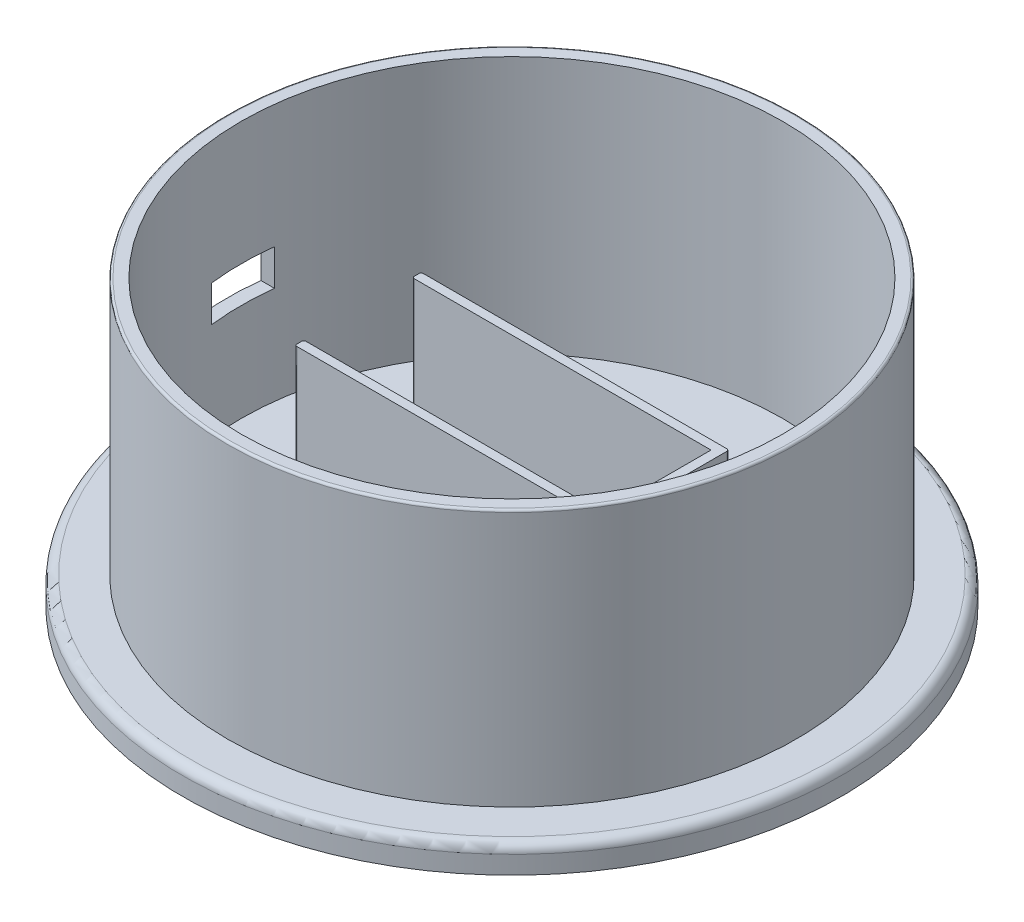
ISO-10303-21;
HEADER;
FILE_DESCRIPTION(('STEP AP214'),'2;1');
FILE_NAME('part.step','',(''),(''),'','','');
FILE_SCHEMA(('AUTOMOTIVE_DESIGN { 1 0 10303 214 1 1 1 1 }'));
ENDSEC;
DATA;
#1=APPLICATION_CONTEXT('core data for automotive mechanical design processes');
#2=APPLICATION_PROTOCOL_DEFINITION('international standard','automotive_design',2000,#1);
#3=PRODUCT_CONTEXT('',#1,'mechanical');
#4=PRODUCT('Part','Part','',(#3));
#5=PRODUCT_RELATED_PRODUCT_CATEGORY('part','',(#4));
#6=PRODUCT_DEFINITION_FORMATION('','',#4);
#7=PRODUCT_DEFINITION_CONTEXT('part definition',#1,'design');
#8=PRODUCT_DEFINITION('design','',#6,#7);
#9=PRODUCT_DEFINITION_SHAPE('','',#8);
#10=(LENGTH_UNIT() NAMED_UNIT(*) SI_UNIT(.MILLI.,.METRE.));
#11=(NAMED_UNIT(*) PLANE_ANGLE_UNIT() SI_UNIT($,.RADIAN.));
#12=(NAMED_UNIT(*) SI_UNIT($,.STERADIAN.) SOLID_ANGLE_UNIT());
#13=UNCERTAINTY_MEASURE_WITH_UNIT(LENGTH_MEASURE(1.E-05),#10,'distance_accuracy_value','');
#14=(GEOMETRIC_REPRESENTATION_CONTEXT(3) GLOBAL_UNCERTAINTY_ASSIGNED_CONTEXT((#13)) GLOBAL_UNIT_ASSIGNED_CONTEXT((#10,
#11,#12)) REPRESENTATION_CONTEXT('',''));
#15=CARTESIAN_POINT('',(0.,0.,0.));
#16=DIRECTION('',(0.,0.,1.));
#17=DIRECTION('',(1.,0.,0.));
#18=AXIS2_PLACEMENT_3D('',#15,#16,#17);
#19=CARTESIAN_POINT('',(0.,28.5,0.));
#20=DIRECTION('',(0.,-1.,0.));
#21=DIRECTION('',(0.,0.,-1.));
#22=AXIS2_PLACEMENT_3D('',#19,#20,#21);
#23=CYLINDRICAL_SURFACE('',#22,31.5);
#24=CARTESIAN_POINT('',(0.,28.25,0.));
#25=DIRECTION('',(0.,1.,0.));
#26=DIRECTION('',(0.,0.,1.));
#27=AXIS2_PLACEMENT_3D('',#24,#25,#26);
#28=CIRCLE('',#27,31.5);
#29=CARTESIAN_POINT('',(0.,28.25,31.5));
#30=VERTEX_POINT('',#29);
#31=EDGE_CURVE('E298',#30,#30,#28,.F.);
#32=ORIENTED_EDGE('',*,*,#31,.T.);
#33=EDGE_LOOP('',(#32));
#34=FACE_BOUND('',#33,.T.);
#35=CARTESIAN_POINT('',(0.,0.,0.));
#36=DIRECTION('',(0.,1.,0.));
#37=DIRECTION('',(0.,0.,1.));
#38=AXIS2_PLACEMENT_3D('',#35,#36,#37);
#39=CIRCLE('',#38,31.5);
#40=CARTESIAN_POINT('',(0.,0.,31.5));
#41=VERTEX_POINT('',#40);
#42=EDGE_CURVE('E274',#41,#41,#39,.T.);
#43=ORIENTED_EDGE('',*,*,#42,.T.);
#44=EDGE_LOOP('',(#43));
#45=FACE_BOUND('',#44,.T.);
#46=DIRECTION('',(0.,-1.,0.));
#47=VECTOR('',#46,1.);
#48=CARTESIAN_POINT('',(-31.3049516849971,28.5,-3.50000000000001));
#49=LINE('',#48,#47);
#50=CARTESIAN_POINT('',(-31.3049516849971,14.8357097841192,-3.50000000000001));
#51=VERTEX_POINT('',#50);
#52=CARTESIAN_POINT('',(-31.3049516849971,10.8357097841192,-3.50000000000001));
#53=VERTEX_POINT('',#52);
#54=EDGE_CURVE('E187',#51,#53,#49,.T.);
#55=ORIENTED_EDGE('',*,*,#54,.F.);
#56=CARTESIAN_POINT('',(0.,14.8357097841192,0.));
#57=DIRECTION('',(0.,-1.,0.));
#58=DIRECTION('',(0.,0.,-1.));
#59=AXIS2_PLACEMENT_3D('',#56,#57,#58);
#60=CIRCLE('',#59,31.5);
#61=CARTESIAN_POINT('',(-31.3049516849971,14.8357097841192,3.49999999999999));
#62=VERTEX_POINT('',#61);
#63=EDGE_CURVE('E169',#62,#51,#60,.T.);
#64=ORIENTED_EDGE('',*,*,#63,.F.);
#65=DIRECTION('',(0.,-1.,0.));
#66=VECTOR('',#65,1.);
#67=CARTESIAN_POINT('',(-31.3049516849971,28.5,3.49999999999999));
#68=LINE('',#67,#66);
#69=CARTESIAN_POINT('',(-31.3049516849971,10.8357097841192,3.49999999999999));
#70=VERTEX_POINT('',#69);
#71=EDGE_CURVE('E514',#70,#62,#68,.F.);
#72=ORIENTED_EDGE('',*,*,#71,.F.);
#73=CARTESIAN_POINT('',(0.,10.8357097841192,0.));
#74=DIRECTION('',(0.,1.,0.));
#75=DIRECTION('',(0.,0.,1.));
#76=AXIS2_PLACEMENT_3D('',#73,#74,#75);
#77=CIRCLE('',#76,31.5);
#78=EDGE_CURVE('E195',#53,#70,#77,.T.);
#79=ORIENTED_EDGE('',*,*,#78,.F.);
#80=EDGE_LOOP('',(#55,#64,#72,#79));
#81=FACE_BOUND('',#80,.T.);
#82=ADVANCED_FACE('F45',(#34,#45,#81),#23,.T.);
#83=CARTESIAN_POINT('',(0.,28.5,0.));
#84=DIRECTION('',(0.,-1.,0.));
#85=DIRECTION('',(0.,0.,-1.));
#86=AXIS2_PLACEMENT_3D('',#83,#84,#85);
#87=CYLINDRICAL_SURFACE('',#86,30.);
#88=CARTESIAN_POINT('',(0.,28.5,0.));
#89=DIRECTION('',(0.,1.,0.));
#90=DIRECTION('',(0.,0.,1.));
#91=AXIS2_PLACEMENT_3D('',#88,#89,#90);
#92=CIRCLE('',#91,30.);
#93=CARTESIAN_POINT('',(0.,28.5,30.));
#94=VERTEX_POINT('',#93);
#95=EDGE_CURVE('E275',#94,#94,#92,.T.);
#96=ORIENTED_EDGE('',*,*,#95,.T.);
#97=EDGE_LOOP('',(#96));
#98=FACE_BOUND('',#97,.T.);
#99=CARTESIAN_POINT('',(0.,0.,0.));
#100=DIRECTION('',(0.,1.,0.));
#101=DIRECTION('',(0.,0.,1.));
#102=AXIS2_PLACEMENT_3D('',#99,#100,#101);
#103=CIRCLE('',#102,30.);
#104=CARTESIAN_POINT('',(0.,0.,30.));
#105=VERTEX_POINT('',#104);
#106=EDGE_CURVE('E280',#105,#105,#103,.T.);
#107=ORIENTED_EDGE('',*,*,#106,.F.);
#108=EDGE_LOOP('',(#107));
#109=FACE_BOUND('',#108,.T.);
#110=CARTESIAN_POINT('',(0.,14.8357097841192,0.));
#111=DIRECTION('',(0.,-1.,0.));
#112=DIRECTION('',(0.,0.,-1.));
#113=AXIS2_PLACEMENT_3D('',#110,#111,#112);
#114=CIRCLE('',#113,30.);
#115=CARTESIAN_POINT('',(-29.7951338308792,14.8357097841192,3.49999999999999));
#116=VERTEX_POINT('',#115);
#117=CARTESIAN_POINT('',(-29.7951338308792,14.8357097841192,-3.50000000000001));
#118=VERTEX_POINT('',#117);
#119=EDGE_CURVE('E182',#116,#118,#114,.T.);
#120=ORIENTED_EDGE('',*,*,#119,.T.);
#121=DIRECTION('',(0.,-1.,0.));
#122=VECTOR('',#121,1.);
#123=CARTESIAN_POINT('',(-29.7951338308792,28.5,-3.50000000000001));
#124=LINE('',#123,#122);
#125=CARTESIAN_POINT('',(-29.7951338308792,10.8357097841192,-3.50000000000001));
#126=VERTEX_POINT('',#125);
#127=EDGE_CURVE('E190',#118,#126,#124,.T.);
#128=ORIENTED_EDGE('',*,*,#127,.T.);
#129=CARTESIAN_POINT('',(0.,10.8357097841192,0.));
#130=DIRECTION('',(0.,1.,0.));
#131=DIRECTION('',(0.,0.,1.));
#132=AXIS2_PLACEMENT_3D('',#129,#130,#131);
#133=CIRCLE('',#132,30.);
#134=CARTESIAN_POINT('',(-29.7951338308792,10.8357097841192,3.49999999999999));
#135=VERTEX_POINT('',#134);
#136=EDGE_CURVE('E519',#126,#135,#133,.T.);
#137=ORIENTED_EDGE('',*,*,#136,.T.);
#138=DIRECTION('',(0.,-1.,0.));
#139=VECTOR('',#138,1.);
#140=CARTESIAN_POINT('',(-29.7951338308792,28.5,3.49999999999999));
#141=LINE('',#140,#139);
#142=EDGE_CURVE('E181',#135,#116,#141,.F.);
#143=ORIENTED_EDGE('',*,*,#142,.T.);
#144=EDGE_LOOP('',(#120,#128,#137,#143));
#145=FACE_BOUND('',#144,.T.);
#146=ADVANCED_FACE('F445',(#98,#109,#145),#87,.F.);
#147=CARTESIAN_POINT('',(0.,0.,0.));
#148=DIRECTION('',(0.,-1.,0.));
#149=DIRECTION('',(0.,0.,-1.));
#150=AXIS2_PLACEMENT_3D('',#147,#148,#149);
#151=PLANE('',#150);
#152=ORIENTED_EDGE('',*,*,#106,.T.);
#153=EDGE_LOOP('',(#152));
#154=FACE_BOUND('',#153,.T.);
#155=DIRECTION('',(0.,0.,1.));
#156=VECTOR('',#155,1.);
#157=CARTESIAN_POINT('',(16.05,0.,-6.00000000000001));
#158=LINE('',#157,#156);
#159=CARTESIAN_POINT('',(16.05,0.,-6.00000000000001));
#160=VERTEX_POINT('',#159);
#161=CARTESIAN_POINT('',(16.05,0.,5.99999999999999));
#162=VERTEX_POINT('',#161);
#163=EDGE_CURVE('E197',#160,#162,#158,.T.);
#164=ORIENTED_EDGE('',*,*,#163,.F.);
#165=DIRECTION('',(1.,0.,0.));
#166=VECTOR('',#165,1.);
#167=CARTESIAN_POINT('',(-16.05,0.,-6.00000000000001));
#168=LINE('',#167,#166);
#169=CARTESIAN_POINT('',(-16.8,0.,-6.00000000000001));
#170=VERTEX_POINT('',#169);
#171=EDGE_CURVE('E211',#170,#160,#168,.T.);
#172=ORIENTED_EDGE('',*,*,#171,.F.);
#173=CARTESIAN_POINT('',(-16.8,0.,-6.25000000000001));
#174=DIRECTION('',(0.,-1.,0.));
#175=DIRECTION('',(0.,0.,-1.));
#176=AXIS2_PLACEMENT_3D('',#173,#174,#175);
#177=CIRCLE('',#176,0.25);
#178=CARTESIAN_POINT('',(-17.05,0.,-6.25000000000001));
#179=VERTEX_POINT('',#178);
#180=EDGE_CURVE('E367',#170,#179,#177,.T.);
#181=ORIENTED_EDGE('',*,*,#180,.T.);
#182=DIRECTION('',(0.,0.,1.));
#183=VECTOR('',#182,1.);
#184=CARTESIAN_POINT('',(-17.05,0.,-7.00000000000001));
#185=LINE('',#184,#183);
#186=CARTESIAN_POINT('',(-17.05,0.,-6.75000000000001));
#187=VERTEX_POINT('',#186);
#188=EDGE_CURVE('E257',#187,#179,#185,.T.);
#189=ORIENTED_EDGE('',*,*,#188,.F.);
#190=CARTESIAN_POINT('',(-16.8,0.,-6.75000000000001));
#191=DIRECTION('',(0.,-1.,0.));
#192=DIRECTION('',(0.,0.,-1.));
#193=AXIS2_PLACEMENT_3D('',#190,#191,#192);
#194=CIRCLE('',#193,0.25);
#195=CARTESIAN_POINT('',(-16.8,0.,-7.00000000000001));
#196=VERTEX_POINT('',#195);
#197=EDGE_CURVE('E370',#187,#196,#194,.T.);
#198=ORIENTED_EDGE('',*,*,#197,.T.);
#199=DIRECTION('',(-1.,0.,0.));
#200=VECTOR('',#199,1.);
#201=CARTESIAN_POINT('',(-17.05,0.,-7.00000000000001));
#202=LINE('',#201,#200);
#203=CARTESIAN_POINT('',(16.8,0.,-7.00000000000001));
#204=VERTEX_POINT('',#203);
#205=EDGE_CURVE('E253',#204,#196,#202,.T.);
#206=ORIENTED_EDGE('',*,*,#205,.F.);
#207=CARTESIAN_POINT('',(16.8,0.,-6.75000000000001));
#208=DIRECTION('',(0.,-1.,0.));
#209=DIRECTION('',(0.,0.,-1.));
#210=AXIS2_PLACEMENT_3D('',#207,#208,#209);
#211=CIRCLE('',#210,0.25);
#212=CARTESIAN_POINT('',(17.05,0.,-6.75000000000001));
#213=VERTEX_POINT('',#212);
#214=EDGE_CURVE('E11',#204,#213,#211,.T.);
#215=ORIENTED_EDGE('',*,*,#214,.T.);
#216=DIRECTION('',(0.,0.,-1.));
#217=VECTOR('',#216,1.);
#218=CARTESIAN_POINT('',(17.05,0.,-7.00000000000001));
#219=LINE('',#218,#217);
#220=CARTESIAN_POINT('',(17.05,0.,6.74999999999999));
#221=VERTEX_POINT('',#220);
#222=EDGE_CURVE('E250',#221,#213,#219,.T.);
#223=ORIENTED_EDGE('',*,*,#222,.F.);
#224=CARTESIAN_POINT('',(16.8,0.,6.74999999999999));
#225=DIRECTION('',(0.,-1.,0.));
#226=DIRECTION('',(0.,0.,-1.));
#227=AXIS2_PLACEMENT_3D('',#224,#225,#226);
#228=CIRCLE('',#227,0.25);
#229=CARTESIAN_POINT('',(16.8,0.,6.99999999999999));
#230=VERTEX_POINT('',#229);
#231=EDGE_CURVE('E54',#221,#230,#228,.T.);
#232=ORIENTED_EDGE('',*,*,#231,.T.);
#233=DIRECTION('',(1.,0.,0.));
#234=VECTOR('',#233,1.);
#235=CARTESIAN_POINT('',(-17.05,0.,6.99999999999999));
#236=LINE('',#235,#234);
#237=CARTESIAN_POINT('',(-16.8,0.,6.99999999999999));
#238=VERTEX_POINT('',#237);
#239=EDGE_CURVE('E246',#238,#230,#236,.T.);
#240=ORIENTED_EDGE('',*,*,#239,.F.);
#241=CARTESIAN_POINT('',(-16.8,0.,6.74999999999999));
#242=DIRECTION('',(0.,-1.,0.));
#243=DIRECTION('',(0.,0.,-1.));
#244=AXIS2_PLACEMENT_3D('',#241,#242,#243);
#245=CIRCLE('',#244,0.25);
#246=CARTESIAN_POINT('',(-17.05,0.,6.74999999999999));
#247=VERTEX_POINT('',#246);
#248=EDGE_CURVE('E361',#238,#247,#245,.T.);
#249=ORIENTED_EDGE('',*,*,#248,.T.);
#250=DIRECTION('',(0.,0.,1.));
#251=VECTOR('',#250,1.);
#252=CARTESIAN_POINT('',(-17.05,0.,5.99999999999999));
#253=LINE('',#252,#251);
#254=CARTESIAN_POINT('',(-17.05,0.,6.25));
#255=VERTEX_POINT('',#254);
#256=EDGE_CURVE('E242',#255,#247,#253,.T.);
#257=ORIENTED_EDGE('',*,*,#256,.F.);
#258=CARTESIAN_POINT('',(-16.8,0.,6.25));
#259=DIRECTION('',(0.,-1.,0.));
#260=DIRECTION('',(0.,0.,-1.));
#261=AXIS2_PLACEMENT_3D('',#258,#259,#260);
#262=CIRCLE('',#261,0.25);
#263=CARTESIAN_POINT('',(-16.8,0.,5.99999999999999));
#264=VERTEX_POINT('',#263);
#265=EDGE_CURVE('E364',#255,#264,#262,.T.);
#266=ORIENTED_EDGE('',*,*,#265,.T.);
#267=DIRECTION('',(-1.,0.,0.));
#268=VECTOR('',#267,1.);
#269=CARTESIAN_POINT('',(-16.05,0.,5.99999999999999));
#270=LINE('',#269,#268);
#271=EDGE_CURVE('E202',#162,#264,#270,.T.);
#272=ORIENTED_EDGE('',*,*,#271,.F.);
#273=EDGE_LOOP('',(#164,#172,#181,#189,#198,#206,#215,#223,#232,#240,#249,#257,#266,#272));
#274=FACE_BOUND('',#273,.T.);
#275=ADVANCED_FACE('F375',(#154,#274),#151,.F.);
#276=CARTESIAN_POINT('',(0.,28.5,0.));
#277=DIRECTION('',(0.,1.,0.));
#278=DIRECTION('',(0.,0.,1.));
#279=AXIS2_PLACEMENT_3D('',#276,#277,#278);
#280=PLANE('',#279);
#281=CARTESIAN_POINT('',(0.,28.5,0.));
#282=DIRECTION('',(0.,1.,0.));
#283=DIRECTION('',(0.,0.,1.));
#284=AXIS2_PLACEMENT_3D('',#281,#282,#283);
#285=CIRCLE('',#284,31.25);
#286=CARTESIAN_POINT('',(0.,28.5,31.25));
#287=VERTEX_POINT('',#286);
#288=EDGE_CURVE('E294',#287,#287,#285,.T.);
#289=ORIENTED_EDGE('',*,*,#288,.T.);
#290=EDGE_LOOP('',(#289));
#291=FACE_BOUND('',#290,.T.);
#292=ORIENTED_EDGE('',*,*,#95,.F.);
#293=EDGE_LOOP('',(#292));
#294=FACE_BOUND('',#293,.T.);
#295=ADVANCED_FACE('F458',(#291,#294),#280,.T.);
#296=CARTESIAN_POINT('',(0.,-3.,0.));
#297=DIRECTION('',(0.,1.,0.));
#298=DIRECTION('',(0.,0.,1.));
#299=AXIS2_PLACEMENT_3D('',#296,#297,#298);
#300=CYLINDRICAL_SURFACE('',#299,36.5);
#301=CARTESIAN_POINT('',(0.,-1.,0.));
#302=DIRECTION('',(0.,-1.,0.));
#303=DIRECTION('',(0.,0.,-1.));
#304=AXIS2_PLACEMENT_3D('',#301,#302,#303);
#305=CIRCLE('',#304,36.5);
#306=CARTESIAN_POINT('',(0.,-1.,-36.5));
#307=VERTEX_POINT('',#306);
#308=EDGE_CURVE('E279',#307,#307,#305,.T.);
#309=ORIENTED_EDGE('',*,*,#308,.T.);
#310=EDGE_LOOP('',(#309));
#311=FACE_BOUND('',#310,.T.);
#312=CARTESIAN_POINT('',(0.,-3.,0.));
#313=DIRECTION('',(0.,-1.,0.));
#314=DIRECTION('',(0.,0.,-1.));
#315=AXIS2_PLACEMENT_3D('',#312,#313,#314);
#316=CIRCLE('',#315,36.5);
#317=CARTESIAN_POINT('',(0.,-3.,-36.5));
#318=VERTEX_POINT('',#317);
#319=EDGE_CURVE('E270',#318,#318,#316,.T.);
#320=ORIENTED_EDGE('',*,*,#319,.F.);
#321=EDGE_LOOP('',(#320));
#322=FACE_BOUND('',#321,.T.);
#323=ADVANCED_FACE('F470',(#311,#322),#300,.T.);
#324=CARTESIAN_POINT('',(0.,-3.,0.));
#325=DIRECTION('',(0.,-1.,0.));
#326=DIRECTION('',(0.,0.,-1.));
#327=AXIS2_PLACEMENT_3D('',#324,#325,#326);
#328=PLANE('',#327);
#329=ORIENTED_EDGE('',*,*,#319,.T.);
#330=EDGE_LOOP('',(#329));
#331=FACE_BOUND('',#330,.T.);
#332=ADVANCED_FACE('F473',(#331),#328,.T.);
#333=CARTESIAN_POINT('',(0.,0.,0.));
#334=DIRECTION('',(0.,-1.,0.));
#335=DIRECTION('',(0.,0.,-1.));
#336=AXIS2_PLACEMENT_3D('',#333,#334,#335);
#337=CIRCLE('',#336,35.5);
#338=CARTESIAN_POINT('',(0.,0.,-35.5));
#339=VERTEX_POINT('',#338);
#340=EDGE_CURVE('E290',#339,#339,#337,.F.);
#341=ORIENTED_EDGE('',*,*,#340,.T.);
#342=EDGE_LOOP('',(#341));
#343=FACE_BOUND('',#342,.T.);
#344=ORIENTED_EDGE('',*,*,#42,.F.);
#345=EDGE_LOOP('',(#344));
#346=FACE_BOUND('',#345,.T.);
#347=ADVANCED_FACE('F478',(#343,#346),#151,.F.);
#348=CARTESIAN_POINT('',(16.05,17.,-6.00000000000001));
#349=DIRECTION('',(1.,0.,0.));
#350=DIRECTION('',(0.,0.,-1.));
#351=AXIS2_PLACEMENT_3D('',#348,#349,#350);
#352=PLANE('',#351);
#353=ORIENTED_EDGE('',*,*,#163,.T.);
#354=DIRECTION('',(0.,-1.,0.));
#355=VECTOR('',#354,1.);
#356=CARTESIAN_POINT('',(16.05,17.,5.99999999999999));
#357=LINE('',#356,#355);
#358=CARTESIAN_POINT('',(16.05,17.,5.99999999999999));
#359=VERTEX_POINT('',#358);
#360=EDGE_CURVE('E237',#359,#162,#357,.T.);
#361=ORIENTED_EDGE('',*,*,#360,.F.);
#362=DIRECTION('',(0.,0.,1.));
#363=VECTOR('',#362,1.);
#364=CARTESIAN_POINT('',(16.05,17.,-6.00000000000001));
#365=LINE('',#364,#363);
#366=CARTESIAN_POINT('',(16.05,17.,-6.00000000000001));
#367=VERTEX_POINT('',#366);
#368=EDGE_CURVE('E210',#367,#359,#365,.T.);
#369=ORIENTED_EDGE('',*,*,#368,.F.);
#370=DIRECTION('',(0.,-1.,0.));
#371=VECTOR('',#370,1.);
#372=CARTESIAN_POINT('',(16.05,17.,-6.00000000000001));
#373=LINE('',#372,#371);
#374=EDGE_CURVE('E266',#367,#160,#373,.T.);
#375=ORIENTED_EDGE('',*,*,#374,.T.);
#376=EDGE_LOOP('',(#353,#361,#369,#375));
#377=FACE_BOUND('',#376,.T.);
#378=ADVANCED_FACE('F415',(#377),#352,.F.);
#379=CARTESIAN_POINT('',(-16.05,17.,5.99999999999999));
#380=DIRECTION('',(0.,0.,1.));
#381=DIRECTION('',(1.,0.,0.));
#382=AXIS2_PLACEMENT_3D('',#379,#380,#381);
#383=PLANE('',#382);
#384=ORIENTED_EDGE('',*,*,#271,.T.);
#385=DIRECTION('',(0.,-1.,0.));
#386=VECTOR('',#385,1.);
#387=CARTESIAN_POINT('',(-16.8,17.,5.99999999999999));
#388=LINE('',#387,#386);
#389=CARTESIAN_POINT('',(-16.8,17.,5.99999999999999));
#390=VERTEX_POINT('',#389);
#391=EDGE_CURVE('E334',#264,#390,#388,.F.);
#392=ORIENTED_EDGE('',*,*,#391,.T.);
#393=DIRECTION('',(-1.,0.,0.));
#394=VECTOR('',#393,1.);
#395=CARTESIAN_POINT('',(-16.05,17.,5.99999999999999));
#396=LINE('',#395,#394);
#397=EDGE_CURVE('E214',#359,#390,#396,.T.);
#398=ORIENTED_EDGE('',*,*,#397,.F.);
#399=ORIENTED_EDGE('',*,*,#360,.T.);
#400=EDGE_LOOP('',(#384,#392,#398,#399));
#401=FACE_BOUND('',#400,.T.);
#402=ADVANCED_FACE('F487',(#401),#383,.F.);
#403=CARTESIAN_POINT('',(-17.05,17.,5.99999999999999));
#404=DIRECTION('',(1.,0.,0.));
#405=DIRECTION('',(0.,0.,-1.));
#406=AXIS2_PLACEMENT_3D('',#403,#404,#405);
#407=PLANE('',#406);
#408=ORIENTED_EDGE('',*,*,#256,.T.);
#409=DIRECTION('',(0.,-1.,0.));
#410=VECTOR('',#409,1.);
#411=CARTESIAN_POINT('',(-17.05,17.,6.74999999999999));
#412=LINE('',#411,#410);
#413=CARTESIAN_POINT('',(-17.05,17.,6.74999999999999));
#414=VERTEX_POINT('',#413);
#415=EDGE_CURVE('E313',#247,#414,#412,.F.);
#416=ORIENTED_EDGE('',*,*,#415,.T.);
#417=DIRECTION('',(0.,0.,1.));
#418=VECTOR('',#417,1.);
#419=CARTESIAN_POINT('',(-17.05,17.,5.99999999999999));
#420=LINE('',#419,#418);
#421=CARTESIAN_POINT('',(-17.05,17.,6.25));
#422=VERTEX_POINT('',#421);
#423=EDGE_CURVE('E218',#422,#414,#420,.T.);
#424=ORIENTED_EDGE('',*,*,#423,.F.);
#425=DIRECTION('',(0.,-1.,0.));
#426=VECTOR('',#425,1.);
#427=CARTESIAN_POINT('',(-17.05,17.,6.25));
#428=LINE('',#427,#426);
#429=EDGE_CURVE('E309',#422,#255,#428,.T.);
#430=ORIENTED_EDGE('',*,*,#429,.T.);
#431=EDGE_LOOP('',(#408,#416,#424,#430));
#432=FACE_BOUND('',#431,.T.);
#433=ADVANCED_FACE('F427',(#432),#407,.F.);
#434=CARTESIAN_POINT('',(-17.05,17.,6.99999999999999));
#435=DIRECTION('',(0.,0.,-1.));
#436=DIRECTION('',(-1.,0.,0.));
#437=AXIS2_PLACEMENT_3D('',#434,#435,#436);
#438=PLANE('',#437);
#439=DIRECTION('',(1.,0.,0.));
#440=VECTOR('',#439,1.);
#441=CARTESIAN_POINT('',(-17.05,17.,6.99999999999999));
#442=LINE('',#441,#440);
#443=CARTESIAN_POINT('',(-16.8,17.,6.99999999999999));
#444=VERTEX_POINT('',#443);
#445=CARTESIAN_POINT('',(16.8,17.,6.99999999999999));
#446=VERTEX_POINT('',#445);
#447=EDGE_CURVE('E222',#444,#446,#442,.T.);
#448=ORIENTED_EDGE('',*,*,#447,.F.);
#449=DIRECTION('',(0.,-1.,0.));
#450=VECTOR('',#449,1.);
#451=CARTESIAN_POINT('',(-16.8,17.,6.99999999999999));
#452=LINE('',#451,#450);
#453=EDGE_CURVE('E305',#444,#238,#452,.T.);
#454=ORIENTED_EDGE('',*,*,#453,.T.);
#455=ORIENTED_EDGE('',*,*,#239,.T.);
#456=DIRECTION('',(0.,-1.,0.));
#457=VECTOR('',#456,1.);
#458=CARTESIAN_POINT('',(16.8,17.,6.99999999999999));
#459=LINE('',#458,#457);
#460=EDGE_CURVE('E302',#230,#446,#459,.F.);
#461=ORIENTED_EDGE('',*,*,#460,.T.);
#462=EDGE_LOOP('',(#448,#454,#455,#461));
#463=FACE_BOUND('',#462,.T.);
#464=ADVANCED_FACE('F378',(#463),#438,.F.);
#465=CARTESIAN_POINT('',(17.05,17.,-7.00000000000001));
#466=DIRECTION('',(-1.,0.,0.));
#467=DIRECTION('',(0.,0.,1.));
#468=AXIS2_PLACEMENT_3D('',#465,#466,#467);
#469=PLANE('',#468);
#470=DIRECTION('',(0.,0.,-1.));
#471=VECTOR('',#470,1.);
#472=CARTESIAN_POINT('',(17.05,17.,-7.00000000000001));
#473=LINE('',#472,#471);
#474=CARTESIAN_POINT('',(17.05,17.,6.74999999999999));
#475=VERTEX_POINT('',#474);
#476=CARTESIAN_POINT('',(17.05,17.,-6.75000000000001));
#477=VERTEX_POINT('',#476);
#478=EDGE_CURVE('E226',#475,#477,#473,.T.);
#479=ORIENTED_EDGE('',*,*,#478,.F.);
#480=DIRECTION('',(0.,-1.,0.));
#481=VECTOR('',#480,1.);
#482=CARTESIAN_POINT('',(17.05,17.,6.74999999999999));
#483=LINE('',#482,#481);
#484=EDGE_CURVE('E358',#475,#221,#483,.T.);
#485=ORIENTED_EDGE('',*,*,#484,.T.);
#486=ORIENTED_EDGE('',*,*,#222,.T.);
#487=DIRECTION('',(0.,-1.,0.));
#488=VECTOR('',#487,1.);
#489=CARTESIAN_POINT('',(17.05,17.,-6.75000000000001));
#490=LINE('',#489,#488);
#491=EDGE_CURVE('E355',#213,#477,#490,.F.);
#492=ORIENTED_EDGE('',*,*,#491,.T.);
#493=EDGE_LOOP('',(#479,#485,#486,#492));
#494=FACE_BOUND('',#493,.T.);
#495=ADVANCED_FACE('F387',(#494),#469,.F.);
#496=CARTESIAN_POINT('',(-17.05,17.,-7.00000000000001));
#497=DIRECTION('',(0.,0.,1.));
#498=DIRECTION('',(1.,0.,0.));
#499=AXIS2_PLACEMENT_3D('',#496,#497,#498);
#500=PLANE('',#499);
#501=ORIENTED_EDGE('',*,*,#205,.T.);
#502=DIRECTION('',(0.,-1.,0.));
#503=VECTOR('',#502,1.);
#504=CARTESIAN_POINT('',(-16.8,17.,-7.00000000000001));
#505=LINE('',#504,#503);
#506=CARTESIAN_POINT('',(-16.8,17.,-7.00000000000001));
#507=VERTEX_POINT('',#506);
#508=EDGE_CURVE('E352',#196,#507,#505,.F.);
#509=ORIENTED_EDGE('',*,*,#508,.T.);
#510=DIRECTION('',(-1.,0.,0.));
#511=VECTOR('',#510,1.);
#512=CARTESIAN_POINT('',(-17.05,17.,-7.00000000000001));
#513=LINE('',#512,#511);
#514=CARTESIAN_POINT('',(16.8,17.,-7.00000000000001));
#515=VERTEX_POINT('',#514);
#516=EDGE_CURVE('E230',#515,#507,#513,.T.);
#517=ORIENTED_EDGE('',*,*,#516,.F.);
#518=DIRECTION('',(0.,-1.,0.));
#519=VECTOR('',#518,1.);
#520=CARTESIAN_POINT('',(16.8,17.,-7.00000000000001));
#521=LINE('',#520,#519);
#522=EDGE_CURVE('E348',#515,#204,#521,.T.);
#523=ORIENTED_EDGE('',*,*,#522,.T.);
#524=EDGE_LOOP('',(#501,#509,#517,#523));
#525=FACE_BOUND('',#524,.T.);
#526=ADVANCED_FACE('F394',(#525),#500,.F.);
#527=CARTESIAN_POINT('',(-17.05,17.,-7.00000000000001));
#528=DIRECTION('',(1.,0.,0.));
#529=DIRECTION('',(0.,0.,-1.));
#530=AXIS2_PLACEMENT_3D('',#527,#528,#529);
#531=PLANE('',#530);
#532=ORIENTED_EDGE('',*,*,#188,.T.);
#533=DIRECTION('',(0.,-1.,0.));
#534=VECTOR('',#533,1.);
#535=CARTESIAN_POINT('',(-17.05,17.,-6.25000000000001));
#536=LINE('',#535,#534);
#537=CARTESIAN_POINT('',(-17.05,17.,-6.25000000000001));
#538=VERTEX_POINT('',#537);
#539=EDGE_CURVE('E345',#179,#538,#536,.F.);
#540=ORIENTED_EDGE('',*,*,#539,.T.);
#541=DIRECTION('',(0.,0.,1.));
#542=VECTOR('',#541,1.);
#543=CARTESIAN_POINT('',(-17.05,17.,-7.00000000000001));
#544=LINE('',#543,#542);
#545=CARTESIAN_POINT('',(-17.05,17.,-6.75000000000001));
#546=VERTEX_POINT('',#545);
#547=EDGE_CURVE('E234',#546,#538,#544,.T.);
#548=ORIENTED_EDGE('',*,*,#547,.F.);
#549=DIRECTION('',(0.,-1.,0.));
#550=VECTOR('',#549,1.);
#551=CARTESIAN_POINT('',(-17.05,17.,-6.75000000000001));
#552=LINE('',#551,#550);
#553=EDGE_CURVE('E341',#546,#187,#552,.T.);
#554=ORIENTED_EDGE('',*,*,#553,.T.);
#555=EDGE_LOOP('',(#532,#540,#548,#554));
#556=FACE_BOUND('',#555,.T.);
#557=ADVANCED_FACE('F402',(#556),#531,.F.);
#558=CARTESIAN_POINT('',(-16.05,17.,-6.00000000000001));
#559=DIRECTION('',(0.,0.,-1.));
#560=DIRECTION('',(-1.,0.,0.));
#561=AXIS2_PLACEMENT_3D('',#558,#559,#560);
#562=PLANE('',#561);
#563=DIRECTION('',(1.,0.,0.));
#564=VECTOR('',#563,1.);
#565=CARTESIAN_POINT('',(-16.05,17.,-6.00000000000001));
#566=LINE('',#565,#564);
#567=CARTESIAN_POINT('',(-16.8,17.,-6.00000000000001));
#568=VERTEX_POINT('',#567);
#569=EDGE_CURVE('E207',#568,#367,#566,.T.);
#570=ORIENTED_EDGE('',*,*,#569,.F.);
#571=DIRECTION('',(0.,-1.,0.));
#572=VECTOR('',#571,1.);
#573=CARTESIAN_POINT('',(-16.8,17.,-6.00000000000001));
#574=LINE('',#573,#572);
#575=EDGE_CURVE('E337',#568,#170,#574,.T.);
#576=ORIENTED_EDGE('',*,*,#575,.T.);
#577=ORIENTED_EDGE('',*,*,#171,.T.);
#578=ORIENTED_EDGE('',*,*,#374,.F.);
#579=EDGE_LOOP('',(#570,#576,#577,#578));
#580=FACE_BOUND('',#579,.T.);
#581=ADVANCED_FACE('F412',(#580),#562,.F.);
#582=CARTESIAN_POINT('',(0.,17.,0.));
#583=DIRECTION('',(0.,-1.,0.));
#584=DIRECTION('',(0.,0.,-1.));
#585=AXIS2_PLACEMENT_3D('',#582,#583,#584);
#586=PLANE('',#585);
#587=ORIENTED_EDGE('',*,*,#423,.T.);
#588=CARTESIAN_POINT('',(-16.8,17.,6.74999999999999));
#589=DIRECTION('',(0.,-1.,0.));
#590=DIRECTION('',(0.,0.,-1.));
#591=AXIS2_PLACEMENT_3D('',#588,#589,#590);
#592=CIRCLE('',#591,0.25);
#593=EDGE_CURVE('E331',#414,#444,#592,.F.);
#594=ORIENTED_EDGE('',*,*,#593,.T.);
#595=ORIENTED_EDGE('',*,*,#447,.T.);
#596=CARTESIAN_POINT('',(16.8,17.,6.74999999999999));
#597=DIRECTION('',(0.,-1.,0.));
#598=DIRECTION('',(0.,0.,-1.));
#599=AXIS2_PLACEMENT_3D('',#596,#597,#598);
#600=CIRCLE('',#599,0.25);
#601=EDGE_CURVE('E319',#446,#475,#600,.F.);
#602=ORIENTED_EDGE('',*,*,#601,.T.);
#603=ORIENTED_EDGE('',*,*,#478,.T.);
#604=CARTESIAN_POINT('',(16.8,17.,-6.75000000000001));
#605=DIRECTION('',(0.,-1.,0.));
#606=DIRECTION('',(0.,0.,-1.));
#607=AXIS2_PLACEMENT_3D('',#604,#605,#606);
#608=CIRCLE('',#607,0.25);
#609=EDGE_CURVE('E316',#477,#515,#608,.F.);
#610=ORIENTED_EDGE('',*,*,#609,.T.);
#611=ORIENTED_EDGE('',*,*,#516,.T.);
#612=CARTESIAN_POINT('',(-16.8,17.,-6.75000000000001));
#613=DIRECTION('',(0.,-1.,0.));
#614=DIRECTION('',(0.,0.,-1.));
#615=AXIS2_PLACEMENT_3D('',#612,#613,#614);
#616=CIRCLE('',#615,0.25);
#617=EDGE_CURVE('E322',#507,#546,#616,.F.);
#618=ORIENTED_EDGE('',*,*,#617,.T.);
#619=ORIENTED_EDGE('',*,*,#547,.T.);
#620=CARTESIAN_POINT('',(-16.8,17.,-6.25000000000001));
#621=DIRECTION('',(0.,-1.,0.));
#622=DIRECTION('',(0.,0.,-1.));
#623=AXIS2_PLACEMENT_3D('',#620,#621,#622);
#624=CIRCLE('',#623,0.25);
#625=EDGE_CURVE('E325',#538,#568,#624,.F.);
#626=ORIENTED_EDGE('',*,*,#625,.T.);
#627=ORIENTED_EDGE('',*,*,#569,.T.);
#628=ORIENTED_EDGE('',*,*,#368,.T.);
#629=ORIENTED_EDGE('',*,*,#397,.T.);
#630=CARTESIAN_POINT('',(-16.8,17.,6.25));
#631=DIRECTION('',(0.,-1.,0.));
#632=DIRECTION('',(0.,0.,-1.));
#633=AXIS2_PLACEMENT_3D('',#630,#631,#632);
#634=CIRCLE('',#633,0.25);
#635=EDGE_CURVE('E328',#390,#422,#634,.F.);
#636=ORIENTED_EDGE('',*,*,#635,.T.);
#637=EDGE_LOOP('',(#587,#594,#595,#602,#603,#610,#611,#618,#619,#626,#627,#628,#629,#636));
#638=FACE_BOUND('',#637,.T.);
#639=ADVANCED_FACE('F384',(#638),#586,.F.);
#640=CARTESIAN_POINT('',(-36.5,14.8357097841192,-3.50000000000001));
#641=DIRECTION('',(0.,0.,1.));
#642=DIRECTION('',(0.,-1.,0.));
#643=AXIS2_PLACEMENT_3D('',#640,#641,#642);
#644=PLANE('',#643);
#645=ORIENTED_EDGE('',*,*,#54,.T.);
#646=DIRECTION('',(1.,0.,0.));
#647=VECTOR('',#646,1.);
#648=CARTESIAN_POINT('',(-36.5,10.8357097841192,-3.50000000000001));
#649=LINE('',#648,#647);
#650=EDGE_CURVE('E527',#53,#126,#649,.T.);
#651=ORIENTED_EDGE('',*,*,#650,.T.);
#652=ORIENTED_EDGE('',*,*,#127,.F.);
#653=DIRECTION('',(1.,0.,0.));
#654=VECTOR('',#653,1.);
#655=CARTESIAN_POINT('',(-36.5,14.8357097841192,-3.50000000000001));
#656=LINE('',#655,#654);
#657=EDGE_CURVE('E172',#51,#118,#656,.T.);
#658=ORIENTED_EDGE('',*,*,#657,.F.);
#659=EDGE_LOOP('',(#645,#651,#652,#658));
#660=FACE_BOUND('',#659,.T.);
#661=ADVANCED_FACE('F185',(#660),#644,.T.);
#662=CARTESIAN_POINT('',(-36.5,10.8357097841192,-3.50000000000001));
#663=DIRECTION('',(0.,1.,0.));
#664=DIRECTION('',(0.,0.,1.));
#665=AXIS2_PLACEMENT_3D('',#662,#663,#664);
#666=PLANE('',#665);
#667=ORIENTED_EDGE('',*,*,#78,.T.);
#668=DIRECTION('',(1.,0.,0.));
#669=VECTOR('',#668,1.);
#670=CARTESIAN_POINT('',(-36.5,10.8357097841192,3.49999999999999));
#671=LINE('',#670,#669);
#672=EDGE_CURVE('E517',#70,#135,#671,.T.);
#673=ORIENTED_EDGE('',*,*,#672,.T.);
#674=ORIENTED_EDGE('',*,*,#136,.F.);
#675=ORIENTED_EDGE('',*,*,#650,.F.);
#676=EDGE_LOOP('',(#667,#673,#674,#675));
#677=FACE_BOUND('',#676,.T.);
#678=ADVANCED_FACE('F505',(#677),#666,.T.);
#679=CARTESIAN_POINT('',(-36.5,14.8357097841192,3.49999999999999));
#680=DIRECTION('',(0.,0.,-1.));
#681=DIRECTION('',(0.,1.,0.));
#682=AXIS2_PLACEMENT_3D('',#679,#680,#681);
#683=PLANE('',#682);
#684=ORIENTED_EDGE('',*,*,#71,.T.);
#685=DIRECTION('',(1.,0.,0.));
#686=VECTOR('',#685,1.);
#687=CARTESIAN_POINT('',(-36.5,14.8357097841192,3.49999999999999));
#688=LINE('',#687,#686);
#689=EDGE_CURVE('E175',#62,#116,#688,.T.);
#690=ORIENTED_EDGE('',*,*,#689,.T.);
#691=ORIENTED_EDGE('',*,*,#142,.F.);
#692=ORIENTED_EDGE('',*,*,#672,.F.);
#693=EDGE_LOOP('',(#684,#690,#691,#692));
#694=FACE_BOUND('',#693,.T.);
#695=ADVANCED_FACE('F464',(#694),#683,.T.);
#696=CARTESIAN_POINT('',(-36.5,14.8357097841192,-3.50000000000001));
#697=DIRECTION('',(0.,-1.,0.));
#698=DIRECTION('',(0.,0.,-1.));
#699=AXIS2_PLACEMENT_3D('',#696,#697,#698);
#700=PLANE('',#699);
#701=ORIENTED_EDGE('',*,*,#63,.T.);
#702=ORIENTED_EDGE('',*,*,#657,.T.);
#703=ORIENTED_EDGE('',*,*,#119,.F.);
#704=ORIENTED_EDGE('',*,*,#689,.F.);
#705=EDGE_LOOP('',(#701,#702,#703,#704));
#706=FACE_BOUND('',#705,.T.);
#707=ADVANCED_FACE('F171',(#706),#700,.T.);
#708=CARTESIAN_POINT('',(0.,-1.,0.));
#709=DIRECTION('',(0.,-1.,0.));
#710=DIRECTION('',(0.,0.,-1.));
#711=AXIS2_PLACEMENT_3D('',#708,#709,#710);
#712=TOROIDAL_SURFACE('',#711,35.5,1.);
#713=ORIENTED_EDGE('',*,*,#340,.F.);
#714=EDGE_LOOP('',(#713));
#715=FACE_BOUND('',#714,.T.);
#716=ORIENTED_EDGE('',*,*,#308,.F.);
#717=EDGE_LOOP('',(#716));
#718=FACE_BOUND('',#717,.T.);
#719=ADVANCED_FACE('F441',(#715,#718),#712,.T.);
#720=CARTESIAN_POINT('',(0.,28.25,0.));
#721=DIRECTION('',(0.,1.,0.));
#722=DIRECTION('',(0.,0.,1.));
#723=AXIS2_PLACEMENT_3D('',#720,#721,#722);
#724=TOROIDAL_SURFACE('',#723,31.25,0.25);
#725=ORIENTED_EDGE('',*,*,#31,.F.);
#726=EDGE_LOOP('',(#725));
#727=FACE_BOUND('',#726,.T.);
#728=ORIENTED_EDGE('',*,*,#288,.F.);
#729=EDGE_LOOP('',(#728));
#730=FACE_BOUND('',#729,.T.);
#731=ADVANCED_FACE('F433',(#727,#730),#724,.T.);
#732=CARTESIAN_POINT('',(-16.8,17.,6.74999999999999));
#733=DIRECTION('',(0.,-1.,0.));
#734=DIRECTION('',(0.,0.,-1.));
#735=AXIS2_PLACEMENT_3D('',#732,#733,#734);
#736=CYLINDRICAL_SURFACE('',#735,0.25);
#737=ORIENTED_EDGE('',*,*,#593,.F.);
#738=ORIENTED_EDGE('',*,*,#415,.F.);
#739=ORIENTED_EDGE('',*,*,#248,.F.);
#740=ORIENTED_EDGE('',*,*,#453,.F.);
#741=EDGE_LOOP('',(#737,#738,#739,#740));
#742=FACE_BOUND('',#741,.T.);
#743=ADVANCED_FACE('F431',(#742),#736,.T.);
#744=CARTESIAN_POINT('',(-16.8,17.,6.25));
#745=DIRECTION('',(0.,-1.,0.));
#746=DIRECTION('',(0.,0.,-1.));
#747=AXIS2_PLACEMENT_3D('',#744,#745,#746);
#748=CYLINDRICAL_SURFACE('',#747,0.25);
#749=ORIENTED_EDGE('',*,*,#635,.F.);
#750=ORIENTED_EDGE('',*,*,#391,.F.);
#751=ORIENTED_EDGE('',*,*,#265,.F.);
#752=ORIENTED_EDGE('',*,*,#429,.F.);
#753=EDGE_LOOP('',(#749,#750,#751,#752));
#754=FACE_BOUND('',#753,.T.);
#755=ADVANCED_FACE('F424',(#754),#748,.T.);
#756=CARTESIAN_POINT('',(-16.8,17.,-6.25000000000001));
#757=DIRECTION('',(0.,-1.,0.));
#758=DIRECTION('',(0.,0.,-1.));
#759=AXIS2_PLACEMENT_3D('',#756,#757,#758);
#760=CYLINDRICAL_SURFACE('',#759,0.25);
#761=ORIENTED_EDGE('',*,*,#625,.F.);
#762=ORIENTED_EDGE('',*,*,#539,.F.);
#763=ORIENTED_EDGE('',*,*,#180,.F.);
#764=ORIENTED_EDGE('',*,*,#575,.F.);
#765=EDGE_LOOP('',(#761,#762,#763,#764));
#766=FACE_BOUND('',#765,.T.);
#767=ADVANCED_FACE('F406',(#766),#760,.T.);
#768=CARTESIAN_POINT('',(-16.8,17.,-6.75000000000001));
#769=DIRECTION('',(0.,-1.,0.));
#770=DIRECTION('',(0.,0.,-1.));
#771=AXIS2_PLACEMENT_3D('',#768,#769,#770);
#772=CYLINDRICAL_SURFACE('',#771,0.25);
#773=ORIENTED_EDGE('',*,*,#617,.F.);
#774=ORIENTED_EDGE('',*,*,#508,.F.);
#775=ORIENTED_EDGE('',*,*,#197,.F.);
#776=ORIENTED_EDGE('',*,*,#553,.F.);
#777=EDGE_LOOP('',(#773,#774,#775,#776));
#778=FACE_BOUND('',#777,.T.);
#779=ADVANCED_FACE('F397',(#778),#772,.T.);
#780=CARTESIAN_POINT('',(16.8,17.,6.74999999999999));
#781=DIRECTION('',(0.,-1.,0.));
#782=DIRECTION('',(0.,0.,-1.));
#783=AXIS2_PLACEMENT_3D('',#780,#781,#782);
#784=CYLINDRICAL_SURFACE('',#783,0.25);
#785=ORIENTED_EDGE('',*,*,#601,.F.);
#786=ORIENTED_EDGE('',*,*,#460,.F.);
#787=ORIENTED_EDGE('',*,*,#231,.F.);
#788=ORIENTED_EDGE('',*,*,#484,.F.);
#789=EDGE_LOOP('',(#785,#786,#787,#788));
#790=FACE_BOUND('',#789,.T.);
#791=ADVANCED_FACE('F381',(#790),#784,.T.);
#792=CARTESIAN_POINT('',(16.8,17.,-6.75000000000001));
#793=DIRECTION('',(0.,-1.,0.));
#794=DIRECTION('',(0.,0.,-1.));
#795=AXIS2_PLACEMENT_3D('',#792,#793,#794);
#796=CYLINDRICAL_SURFACE('',#795,0.25);
#797=ORIENTED_EDGE('',*,*,#609,.F.);
#798=ORIENTED_EDGE('',*,*,#491,.F.);
#799=ORIENTED_EDGE('',*,*,#214,.F.);
#800=ORIENTED_EDGE('',*,*,#522,.F.);
#801=EDGE_LOOP('',(#797,#798,#799,#800));
#802=FACE_BOUND('',#801,.T.);
#803=ADVANCED_FACE('F47',(#802),#796,.T.);
#804=CLOSED_SHELL('',(#82,#146,#275,#295,#323,#332,#347,#378,#402,#433,#464,#495,#526,#557,#581,
#639,#661,#678,#695,#707,#719,#731,#743,#755,#767,#779,#791,#803));
#805=MANIFOLD_SOLID_BREP('B2',#804);
#806=ADVANCED_BREP_SHAPE_REPRESENTATION('',(#18,#805),#14);
#807=SHAPE_DEFINITION_REPRESENTATION(#9,#806);
ENDSEC;
END-ISO-10303-21;
